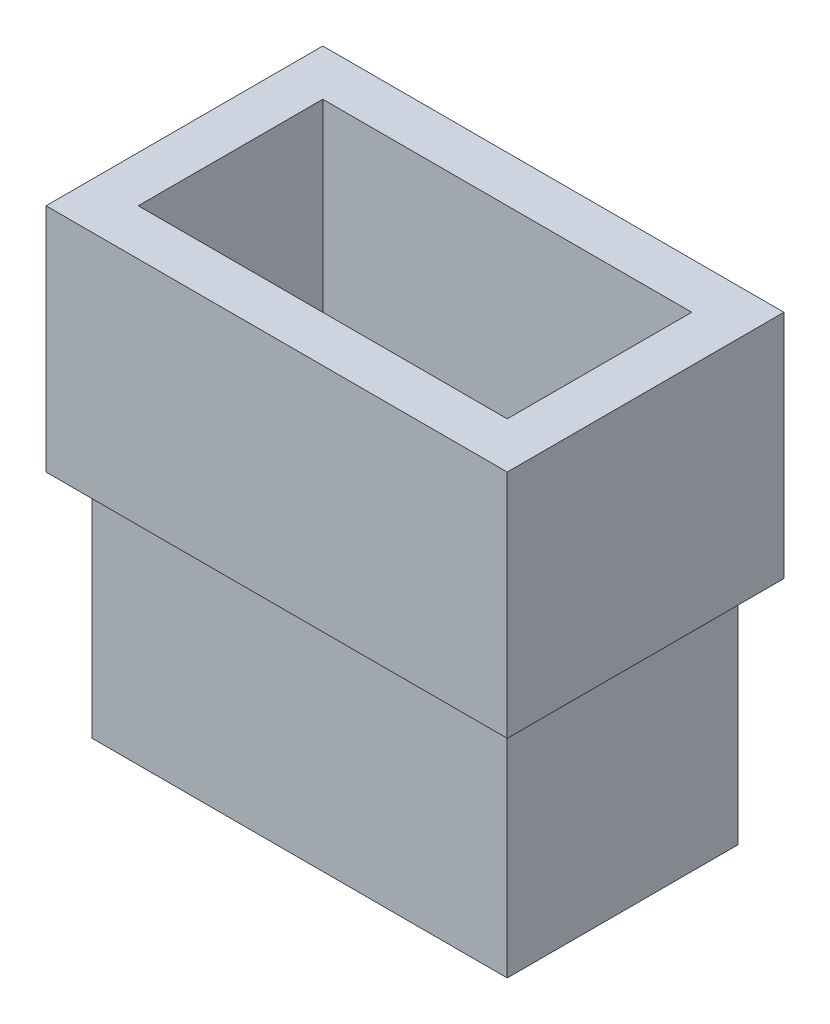
ISO-10303-21;
HEADER;
FILE_DESCRIPTION(('STEP AP214'),'2;1');
FILE_NAME('part.step','',(''),(''),'','','');
FILE_SCHEMA(('AUTOMOTIVE_DESIGN { 1 0 10303 214 1 1 1 1 }'));
ENDSEC;
DATA;
#1=APPLICATION_CONTEXT('core data for automotive mechanical design processes');
#2=APPLICATION_PROTOCOL_DEFINITION('international standard','automotive_design',2000,#1);
#3=PRODUCT_CONTEXT('',#1,'mechanical');
#4=PRODUCT('Part','Part','',(#3));
#5=PRODUCT_RELATED_PRODUCT_CATEGORY('part','',(#4));
#6=PRODUCT_DEFINITION_FORMATION('','',#4);
#7=PRODUCT_DEFINITION_CONTEXT('part definition',#1,'design');
#8=PRODUCT_DEFINITION('design','',#6,#7);
#9=PRODUCT_DEFINITION_SHAPE('','',#8);
#10=(LENGTH_UNIT() NAMED_UNIT(*) SI_UNIT(.MILLI.,.METRE.));
#11=(NAMED_UNIT(*) PLANE_ANGLE_UNIT() SI_UNIT($,.RADIAN.));
#12=(NAMED_UNIT(*) SI_UNIT($,.STERADIAN.) SOLID_ANGLE_UNIT());
#13=UNCERTAINTY_MEASURE_WITH_UNIT(LENGTH_MEASURE(1.E-05),#10,'distance_accuracy_value','');
#14=(GEOMETRIC_REPRESENTATION_CONTEXT(3) GLOBAL_UNCERTAINTY_ASSIGNED_CONTEXT((#13)) GLOBAL_UNIT_ASSIGNED_CONTEXT((#10,
#11,#12)) REPRESENTATION_CONTEXT('',''));
#15=CARTESIAN_POINT('',(0.,0.,0.));
#16=DIRECTION('',(0.,0.,1.));
#17=DIRECTION('',(1.,0.,0.));
#18=AXIS2_PLACEMENT_3D('',#15,#16,#17);
#19=CARTESIAN_POINT('',(0.,0.,0.));
#20=DIRECTION('',(0.,1.,0.));
#21=DIRECTION('',(0.,0.,1.));
#22=AXIS2_PLACEMENT_3D('',#19,#20,#21);
#23=PLANE('',#22);
#24=DIRECTION('',(1.,0.,0.));
#25=VECTOR('',#24,1.);
#26=CARTESIAN_POINT('',(0.,0.,15.));
#27=LINE('',#26,#25);
#28=CARTESIAN_POINT('',(-25.,0.,15.));
#29=VERTEX_POINT('',#28);
#30=CARTESIAN_POINT('',(25.,0.,15.));
#31=VERTEX_POINT('',#30);
#32=EDGE_CURVE('E141',#29,#31,#27,.T.);
#33=ORIENTED_EDGE('',*,*,#32,.F.);
#34=DIRECTION('',(0.,0.,-1.));
#35=VECTOR('',#34,1.);
#36=CARTESIAN_POINT('',(-25.,0.,0.));
#37=LINE('',#36,#35);
#38=CARTESIAN_POINT('',(-25.,0.,-15.));
#39=VERTEX_POINT('',#38);
#40=EDGE_CURVE('E147',#29,#39,#37,.T.);
#41=ORIENTED_EDGE('',*,*,#40,.T.);
#42=DIRECTION('',(1.,0.,0.));
#43=VECTOR('',#42,1.);
#44=CARTESIAN_POINT('',(0.,0.,-15.));
#45=LINE('',#44,#43);
#46=CARTESIAN_POINT('',(25.,0.,-15.));
#47=VERTEX_POINT('',#46);
#48=EDGE_CURVE('E145',#39,#47,#45,.T.);
#49=ORIENTED_EDGE('',*,*,#48,.T.);
#50=DIRECTION('',(0.,0.,-1.));
#51=VECTOR('',#50,1.);
#52=CARTESIAN_POINT('',(25.,0.,0.));
#53=LINE('',#52,#51);
#54=EDGE_CURVE('E128',#31,#47,#53,.T.);
#55=ORIENTED_EDGE('',*,*,#54,.F.);
#56=EDGE_LOOP('',(#33,#41,#49,#55));
#57=FACE_BOUND('',#56,.T.);
#58=DIRECTION('',(0.,0.,-1.));
#59=VECTOR('',#58,1.);
#60=CARTESIAN_POINT('',(-22.5,0.,0.));
#61=LINE('',#60,#59);
#62=CARTESIAN_POINT('',(-22.5,0.,12.5));
#63=VERTEX_POINT('',#62);
#64=CARTESIAN_POINT('',(-22.5,0.,-12.5));
#65=VERTEX_POINT('',#64);
#66=EDGE_CURVE('E206',#63,#65,#61,.T.);
#67=ORIENTED_EDGE('',*,*,#66,.F.);
#68=DIRECTION('',(1.,0.,0.));
#69=VECTOR('',#68,1.);
#70=CARTESIAN_POINT('',(0.,0.,12.5));
#71=LINE('',#70,#69);
#72=CARTESIAN_POINT('',(22.5,0.,12.5));
#73=VERTEX_POINT('',#72);
#74=EDGE_CURVE('E209',#63,#73,#71,.T.);
#75=ORIENTED_EDGE('',*,*,#74,.T.);
#76=DIRECTION('',(0.,0.,-1.));
#77=VECTOR('',#76,1.);
#78=CARTESIAN_POINT('',(22.5,0.,0.));
#79=LINE('',#78,#77);
#80=CARTESIAN_POINT('',(22.5,0.,-12.5));
#81=VERTEX_POINT('',#80);
#82=EDGE_CURVE('E60',#73,#81,#79,.T.);
#83=ORIENTED_EDGE('',*,*,#82,.T.);
#84=DIRECTION('',(1.,0.,0.));
#85=VECTOR('',#84,1.);
#86=CARTESIAN_POINT('',(0.,0.,-12.5));
#87=LINE('',#86,#85);
#88=EDGE_CURVE('E185',#65,#81,#87,.T.);
#89=ORIENTED_EDGE('',*,*,#88,.F.);
#90=EDGE_LOOP('',(#67,#75,#83,#89));
#91=FACE_BOUND('',#90,.T.);
#92=ADVANCED_FACE('F43',(#57,#91),#23,.F.);
#93=CARTESIAN_POINT('',(0.,25.,15.));
#94=DIRECTION('',(0.,0.,-1.));
#95=DIRECTION('',(-1.,0.,0.));
#96=AXIS2_PLACEMENT_3D('',#93,#94,#95);
#97=PLANE('',#96);
#98=ORIENTED_EDGE('',*,*,#32,.T.);
#99=DIRECTION('',(0.,-1.,0.));
#100=VECTOR('',#99,1.);
#101=CARTESIAN_POINT('',(25.,25.,15.));
#102=LINE('',#101,#100);
#103=CARTESIAN_POINT('',(25.,25.,15.));
#104=VERTEX_POINT('',#103);
#105=EDGE_CURVE('E11',#104,#31,#102,.T.);
#106=ORIENTED_EDGE('',*,*,#105,.F.);
#107=DIRECTION('',(1.,0.,0.));
#108=VECTOR('',#107,1.);
#109=CARTESIAN_POINT('',(0.,25.,15.));
#110=LINE('',#109,#108);
#111=CARTESIAN_POINT('',(-25.,25.,15.));
#112=VERTEX_POINT('',#111);
#113=EDGE_CURVE('E122',#112,#104,#110,.T.);
#114=ORIENTED_EDGE('',*,*,#113,.F.);
#115=DIRECTION('',(0.,-1.,0.));
#116=VECTOR('',#115,1.);
#117=CARTESIAN_POINT('',(-25.,25.,15.));
#118=LINE('',#117,#116);
#119=EDGE_CURVE('E69',#112,#29,#118,.T.);
#120=ORIENTED_EDGE('',*,*,#119,.T.);
#121=EDGE_LOOP('',(#98,#106,#114,#120));
#122=FACE_BOUND('',#121,.T.);
#123=ADVANCED_FACE('F271',(#122),#97,.F.);
#124=CARTESIAN_POINT('',(25.,25.,0.));
#125=DIRECTION('',(-1.,0.,0.));
#126=DIRECTION('',(0.,0.,1.));
#127=AXIS2_PLACEMENT_3D('',#124,#125,#126);
#128=PLANE('',#127);
#129=ORIENTED_EDGE('',*,*,#54,.T.);
#130=DIRECTION('',(0.,-1.,0.));
#131=VECTOR('',#130,1.);
#132=CARTESIAN_POINT('',(25.,25.,-15.));
#133=LINE('',#132,#131);
#134=CARTESIAN_POINT('',(25.,25.,-15.));
#135=VERTEX_POINT('',#134);
#136=EDGE_CURVE('E52',#135,#47,#133,.T.);
#137=ORIENTED_EDGE('',*,*,#136,.F.);
#138=DIRECTION('',(0.,0.,-1.));
#139=VECTOR('',#138,1.);
#140=CARTESIAN_POINT('',(25.,25.,0.));
#141=LINE('',#140,#139);
#142=EDGE_CURVE('E116',#104,#135,#141,.T.);
#143=ORIENTED_EDGE('',*,*,#142,.F.);
#144=ORIENTED_EDGE('',*,*,#105,.T.);
#145=EDGE_LOOP('',(#129,#137,#143,#144));
#146=FACE_BOUND('',#145,.T.);
#147=ADVANCED_FACE('F127',(#146),#128,.F.);
#148=CARTESIAN_POINT('',(0.,25.,-15.));
#149=DIRECTION('',(0.,0.,-1.));
#150=DIRECTION('',(-1.,0.,0.));
#151=AXIS2_PLACEMENT_3D('',#148,#149,#150);
#152=PLANE('',#151);
#153=ORIENTED_EDGE('',*,*,#48,.F.);
#154=DIRECTION('',(0.,-1.,0.));
#155=VECTOR('',#154,1.);
#156=CARTESIAN_POINT('',(-25.,25.,-15.));
#157=LINE('',#156,#155);
#158=CARTESIAN_POINT('',(-25.,25.,-15.));
#159=VERTEX_POINT('',#158);
#160=EDGE_CURVE('E132',#159,#39,#157,.T.);
#161=ORIENTED_EDGE('',*,*,#160,.F.);
#162=DIRECTION('',(1.,0.,0.));
#163=VECTOR('',#162,1.);
#164=CARTESIAN_POINT('',(0.,25.,-15.));
#165=LINE('',#164,#163);
#166=EDGE_CURVE('E121',#159,#135,#165,.T.);
#167=ORIENTED_EDGE('',*,*,#166,.T.);
#168=ORIENTED_EDGE('',*,*,#136,.T.);
#169=EDGE_LOOP('',(#153,#161,#167,#168));
#170=FACE_BOUND('',#169,.T.);
#171=ADVANCED_FACE('F134',(#170),#152,.T.);
#172=CARTESIAN_POINT('',(20.,25.,0.));
#173=DIRECTION('',(-1.,0.,0.));
#174=DIRECTION('',(0.,0.,1.));
#175=AXIS2_PLACEMENT_3D('',#172,#173,#174);
#176=PLANE('',#175);
#177=DIRECTION('',(0.,-1.,0.));
#178=VECTOR('',#177,1.);
#179=CARTESIAN_POINT('',(20.,25.,-10.));
#180=LINE('',#179,#178);
#181=CARTESIAN_POINT('',(20.,25.,-10.));
#182=VERTEX_POINT('',#181);
#183=CARTESIAN_POINT('',(20.,-25.,-10.));
#184=VERTEX_POINT('',#183);
#185=EDGE_CURVE('E137',#182,#184,#180,.T.);
#186=ORIENTED_EDGE('',*,*,#185,.T.);
#187=DIRECTION('',(0.,0.,-1.));
#188=VECTOR('',#187,1.);
#189=CARTESIAN_POINT('',(20.,-25.,0.));
#190=LINE('',#189,#188);
#191=CARTESIAN_POINT('',(20.,-25.,10.));
#192=VERTEX_POINT('',#191);
#193=EDGE_CURVE('E180',#192,#184,#190,.T.);
#194=ORIENTED_EDGE('',*,*,#193,.F.);
#195=DIRECTION('',(0.,-1.,0.));
#196=VECTOR('',#195,1.);
#197=CARTESIAN_POINT('',(20.,25.,10.));
#198=LINE('',#197,#196);
#199=CARTESIAN_POINT('',(20.,25.,10.));
#200=VERTEX_POINT('',#199);
#201=EDGE_CURVE('E47',#200,#192,#198,.T.);
#202=ORIENTED_EDGE('',*,*,#201,.F.);
#203=DIRECTION('',(0.,0.,-1.));
#204=VECTOR('',#203,1.);
#205=CARTESIAN_POINT('',(20.,25.,0.));
#206=LINE('',#205,#204);
#207=EDGE_CURVE('E150',#200,#182,#206,.T.);
#208=ORIENTED_EDGE('',*,*,#207,.T.);
#209=EDGE_LOOP('',(#186,#194,#202,#208));
#210=FACE_BOUND('',#209,.T.);
#211=ADVANCED_FACE('F45',(#210),#176,.T.);
#212=CARTESIAN_POINT('',(0.,25.,10.));
#213=DIRECTION('',(0.,0.,-1.));
#214=DIRECTION('',(-1.,0.,0.));
#215=AXIS2_PLACEMENT_3D('',#212,#213,#214);
#216=PLANE('',#215);
#217=ORIENTED_EDGE('',*,*,#201,.T.);
#218=DIRECTION('',(1.,0.,0.));
#219=VECTOR('',#218,1.);
#220=CARTESIAN_POINT('',(0.,-25.,10.));
#221=LINE('',#220,#219);
#222=CARTESIAN_POINT('',(-20.,-25.,10.));
#223=VERTEX_POINT('',#222);
#224=EDGE_CURVE('E169',#223,#192,#221,.T.);
#225=ORIENTED_EDGE('',*,*,#224,.F.);
#226=DIRECTION('',(0.,-1.,0.));
#227=VECTOR('',#226,1.);
#228=CARTESIAN_POINT('',(-20.,25.,10.));
#229=LINE('',#228,#227);
#230=CARTESIAN_POINT('',(-20.,25.,10.));
#231=VERTEX_POINT('',#230);
#232=EDGE_CURVE('E157',#231,#223,#229,.T.);
#233=ORIENTED_EDGE('',*,*,#232,.F.);
#234=DIRECTION('',(1.,0.,0.));
#235=VECTOR('',#234,1.);
#236=CARTESIAN_POINT('',(0.,25.,10.));
#237=LINE('',#236,#235);
#238=EDGE_CURVE('E172',#231,#200,#237,.T.);
#239=ORIENTED_EDGE('',*,*,#238,.T.);
#240=EDGE_LOOP('',(#217,#225,#233,#239));
#241=FACE_BOUND('',#240,.T.);
#242=ADVANCED_FACE('F168',(#241),#216,.T.);
#243=CARTESIAN_POINT('',(-20.,25.,0.));
#244=DIRECTION('',(-1.,0.,0.));
#245=DIRECTION('',(0.,0.,1.));
#246=AXIS2_PLACEMENT_3D('',#243,#244,#245);
#247=PLANE('',#246);
#248=ORIENTED_EDGE('',*,*,#232,.T.);
#249=DIRECTION('',(0.,0.,-1.));
#250=VECTOR('',#249,1.);
#251=CARTESIAN_POINT('',(-20.,-25.,0.));
#252=LINE('',#251,#250);
#253=CARTESIAN_POINT('',(-20.,-25.,-10.));
#254=VERTEX_POINT('',#253);
#255=EDGE_CURVE('E182',#223,#254,#252,.T.);
#256=ORIENTED_EDGE('',*,*,#255,.T.);
#257=DIRECTION('',(0.,-1.,0.));
#258=VECTOR('',#257,1.);
#259=CARTESIAN_POINT('',(-20.,25.,-10.));
#260=LINE('',#259,#258);
#261=CARTESIAN_POINT('',(-20.,25.,-10.));
#262=VERTEX_POINT('',#261);
#263=EDGE_CURVE('E155',#262,#254,#260,.T.);
#264=ORIENTED_EDGE('',*,*,#263,.F.);
#265=DIRECTION('',(0.,0.,-1.));
#266=VECTOR('',#265,1.);
#267=CARTESIAN_POINT('',(-20.,25.,0.));
#268=LINE('',#267,#266);
#269=EDGE_CURVE('E223',#231,#262,#268,.T.);
#270=ORIENTED_EDGE('',*,*,#269,.F.);
#271=EDGE_LOOP('',(#248,#256,#264,#270));
#272=FACE_BOUND('',#271,.T.);
#273=ADVANCED_FACE('F292',(#272),#247,.F.);
#274=CARTESIAN_POINT('',(0.,25.,-10.));
#275=DIRECTION('',(0.,0.,-1.));
#276=DIRECTION('',(-1.,0.,0.));
#277=AXIS2_PLACEMENT_3D('',#274,#275,#276);
#278=PLANE('',#277);
#279=ORIENTED_EDGE('',*,*,#263,.T.);
#280=DIRECTION('',(1.,0.,0.));
#281=VECTOR('',#280,1.);
#282=CARTESIAN_POINT('',(0.,-25.,-10.));
#283=LINE('',#282,#281);
#284=EDGE_CURVE('E191',#254,#184,#283,.T.);
#285=ORIENTED_EDGE('',*,*,#284,.T.);
#286=ORIENTED_EDGE('',*,*,#185,.F.);
#287=DIRECTION('',(1.,0.,0.));
#288=VECTOR('',#287,1.);
#289=CARTESIAN_POINT('',(0.,25.,-10.));
#290=LINE('',#289,#288);
#291=EDGE_CURVE('E225',#262,#182,#290,.T.);
#292=ORIENTED_EDGE('',*,*,#291,.F.);
#293=EDGE_LOOP('',(#279,#285,#286,#292));
#294=FACE_BOUND('',#293,.T.);
#295=ADVANCED_FACE('F230',(#294),#278,.F.);
#296=CARTESIAN_POINT('',(-25.,25.,0.));
#297=DIRECTION('',(-1.,0.,0.));
#298=DIRECTION('',(0.,0.,1.));
#299=AXIS2_PLACEMENT_3D('',#296,#297,#298);
#300=PLANE('',#299);
#301=ORIENTED_EDGE('',*,*,#40,.F.);
#302=ORIENTED_EDGE('',*,*,#119,.F.);
#303=DIRECTION('',(0.,0.,-1.));
#304=VECTOR('',#303,1.);
#305=CARTESIAN_POINT('',(-25.,25.,0.));
#306=LINE('',#305,#304);
#307=EDGE_CURVE('E135',#112,#159,#306,.T.);
#308=ORIENTED_EDGE('',*,*,#307,.T.);
#309=ORIENTED_EDGE('',*,*,#160,.T.);
#310=EDGE_LOOP('',(#301,#302,#308,#309));
#311=FACE_BOUND('',#310,.T.);
#312=ADVANCED_FACE('F283',(#311),#300,.T.);
#313=CARTESIAN_POINT('',(0.,25.,0.));
#314=DIRECTION('',(0.,1.,0.));
#315=DIRECTION('',(0.,0.,1.));
#316=AXIS2_PLACEMENT_3D('',#313,#314,#315);
#317=PLANE('',#316);
#318=ORIENTED_EDGE('',*,*,#207,.F.);
#319=ORIENTED_EDGE('',*,*,#238,.F.);
#320=ORIENTED_EDGE('',*,*,#269,.T.);
#321=ORIENTED_EDGE('',*,*,#291,.T.);
#322=EDGE_LOOP('',(#318,#319,#320,#321));
#323=FACE_BOUND('',#322,.T.);
#324=ORIENTED_EDGE('',*,*,#113,.T.);
#325=ORIENTED_EDGE('',*,*,#142,.T.);
#326=ORIENTED_EDGE('',*,*,#166,.F.);
#327=ORIENTED_EDGE('',*,*,#307,.F.);
#328=EDGE_LOOP('',(#324,#325,#326,#327));
#329=FACE_BOUND('',#328,.T.);
#330=ADVANCED_FACE('F118',(#323,#329),#317,.T.);
#331=CARTESIAN_POINT('',(-22.5,-25.,0.));
#332=DIRECTION('',(1.,0.,0.));
#333=DIRECTION('',(0.,0.,-1.));
#334=AXIS2_PLACEMENT_3D('',#331,#332,#333);
#335=PLANE('',#334);
#336=ORIENTED_EDGE('',*,*,#66,.T.);
#337=DIRECTION('',(0.,1.,0.));
#338=VECTOR('',#337,1.);
#339=CARTESIAN_POINT('',(-22.5,-25.,-12.5));
#340=LINE('',#339,#338);
#341=CARTESIAN_POINT('',(-22.5,-25.,-12.5));
#342=VERTEX_POINT('',#341);
#343=EDGE_CURVE('E143',#342,#65,#340,.T.);
#344=ORIENTED_EDGE('',*,*,#343,.F.);
#345=DIRECTION('',(0.,0.,-1.));
#346=VECTOR('',#345,1.);
#347=CARTESIAN_POINT('',(-22.5,-25.,0.));
#348=LINE('',#347,#346);
#349=CARTESIAN_POINT('',(-22.5,-25.,12.5));
#350=VERTEX_POINT('',#349);
#351=EDGE_CURVE('E193',#350,#342,#348,.T.);
#352=ORIENTED_EDGE('',*,*,#351,.F.);
#353=DIRECTION('',(0.,1.,0.));
#354=VECTOR('',#353,1.);
#355=CARTESIAN_POINT('',(-22.5,-25.,12.5));
#356=LINE('',#355,#354);
#357=EDGE_CURVE('E205',#350,#63,#356,.T.);
#358=ORIENTED_EDGE('',*,*,#357,.T.);
#359=EDGE_LOOP('',(#336,#344,#352,#358));
#360=FACE_BOUND('',#359,.T.);
#361=ADVANCED_FACE('F255',(#360),#335,.F.);
#362=CARTESIAN_POINT('',(0.,-25.,-12.5));
#363=DIRECTION('',(0.,0.,1.));
#364=DIRECTION('',(1.,0.,0.));
#365=AXIS2_PLACEMENT_3D('',#362,#363,#364);
#366=PLANE('',#365);
#367=ORIENTED_EDGE('',*,*,#88,.T.);
#368=DIRECTION('',(0.,1.,0.));
#369=VECTOR('',#368,1.);
#370=CARTESIAN_POINT('',(22.5,-25.,-12.5));
#371=LINE('',#370,#369);
#372=CARTESIAN_POINT('',(22.5,-25.,-12.5));
#373=VERTEX_POINT('',#372);
#374=EDGE_CURVE('E215',#373,#81,#371,.T.);
#375=ORIENTED_EDGE('',*,*,#374,.F.);
#376=DIRECTION('',(1.,0.,0.));
#377=VECTOR('',#376,1.);
#378=CARTESIAN_POINT('',(0.,-25.,-12.5));
#379=LINE('',#378,#377);
#380=EDGE_CURVE('E202',#342,#373,#379,.T.);
#381=ORIENTED_EDGE('',*,*,#380,.F.);
#382=ORIENTED_EDGE('',*,*,#343,.T.);
#383=EDGE_LOOP('',(#367,#375,#381,#382));
#384=FACE_BOUND('',#383,.T.);
#385=ADVANCED_FACE('F250',(#384),#366,.F.);
#386=CARTESIAN_POINT('',(22.5,-25.,0.));
#387=DIRECTION('',(1.,0.,0.));
#388=DIRECTION('',(0.,0.,-1.));
#389=AXIS2_PLACEMENT_3D('',#386,#387,#388);
#390=PLANE('',#389);
#391=ORIENTED_EDGE('',*,*,#82,.F.);
#392=DIRECTION('',(0.,1.,0.));
#393=VECTOR('',#392,1.);
#394=CARTESIAN_POINT('',(22.5,-25.,12.5));
#395=LINE('',#394,#393);
#396=CARTESIAN_POINT('',(22.5,-25.,12.5));
#397=VERTEX_POINT('',#396);
#398=EDGE_CURVE('E217',#397,#73,#395,.T.);
#399=ORIENTED_EDGE('',*,*,#398,.F.);
#400=DIRECTION('',(0.,0.,-1.));
#401=VECTOR('',#400,1.);
#402=CARTESIAN_POINT('',(22.5,-25.,0.));
#403=LINE('',#402,#401);
#404=EDGE_CURVE('E199',#397,#373,#403,.T.);
#405=ORIENTED_EDGE('',*,*,#404,.T.);
#406=ORIENTED_EDGE('',*,*,#374,.T.);
#407=EDGE_LOOP('',(#391,#399,#405,#406));
#408=FACE_BOUND('',#407,.T.);
#409=ADVANCED_FACE('F262',(#408),#390,.T.);
#410=CARTESIAN_POINT('',(0.,-25.,12.5));
#411=DIRECTION('',(0.,0.,1.));
#412=DIRECTION('',(1.,0.,0.));
#413=AXIS2_PLACEMENT_3D('',#410,#411,#412);
#414=PLANE('',#413);
#415=ORIENTED_EDGE('',*,*,#74,.F.);
#416=ORIENTED_EDGE('',*,*,#357,.F.);
#417=DIRECTION('',(1.,0.,0.));
#418=VECTOR('',#417,1.);
#419=CARTESIAN_POINT('',(0.,-25.,12.5));
#420=LINE('',#419,#418);
#421=EDGE_CURVE('E196',#350,#397,#420,.T.);
#422=ORIENTED_EDGE('',*,*,#421,.T.);
#423=ORIENTED_EDGE('',*,*,#398,.T.);
#424=EDGE_LOOP('',(#415,#416,#422,#423));
#425=FACE_BOUND('',#424,.T.);
#426=ADVANCED_FACE('F259',(#425),#414,.T.);
#427=CARTESIAN_POINT('',(0.,-25.,0.));
#428=DIRECTION('',(0.,1.,0.));
#429=DIRECTION('',(0.,0.,1.));
#430=AXIS2_PLACEMENT_3D('',#427,#428,#429);
#431=PLANE('',#430);
#432=ORIENTED_EDGE('',*,*,#193,.T.);
#433=ORIENTED_EDGE('',*,*,#284,.F.);
#434=ORIENTED_EDGE('',*,*,#255,.F.);
#435=ORIENTED_EDGE('',*,*,#224,.T.);
#436=EDGE_LOOP('',(#432,#433,#434,#435));
#437=FACE_BOUND('',#436,.T.);
#438=ORIENTED_EDGE('',*,*,#351,.T.);
#439=ORIENTED_EDGE('',*,*,#380,.T.);
#440=ORIENTED_EDGE('',*,*,#404,.F.);
#441=ORIENTED_EDGE('',*,*,#421,.F.);
#442=EDGE_LOOP('',(#438,#439,#440,#441));
#443=FACE_BOUND('',#442,.T.);
#444=ADVANCED_FACE('F176',(#437,#443),#431,.F.);
#445=CLOSED_SHELL('',(#92,#123,#147,#171,#211,#242,#273,#295,#312,#330,#361,#385,#409,#426,#444));
#446=MANIFOLD_SOLID_BREP('B2',#445);
#447=ADVANCED_BREP_SHAPE_REPRESENTATION('',(#18,#446),#14);
#448=SHAPE_DEFINITION_REPRESENTATION(#9,#447);
ENDSEC;
END-ISO-10303-21;
